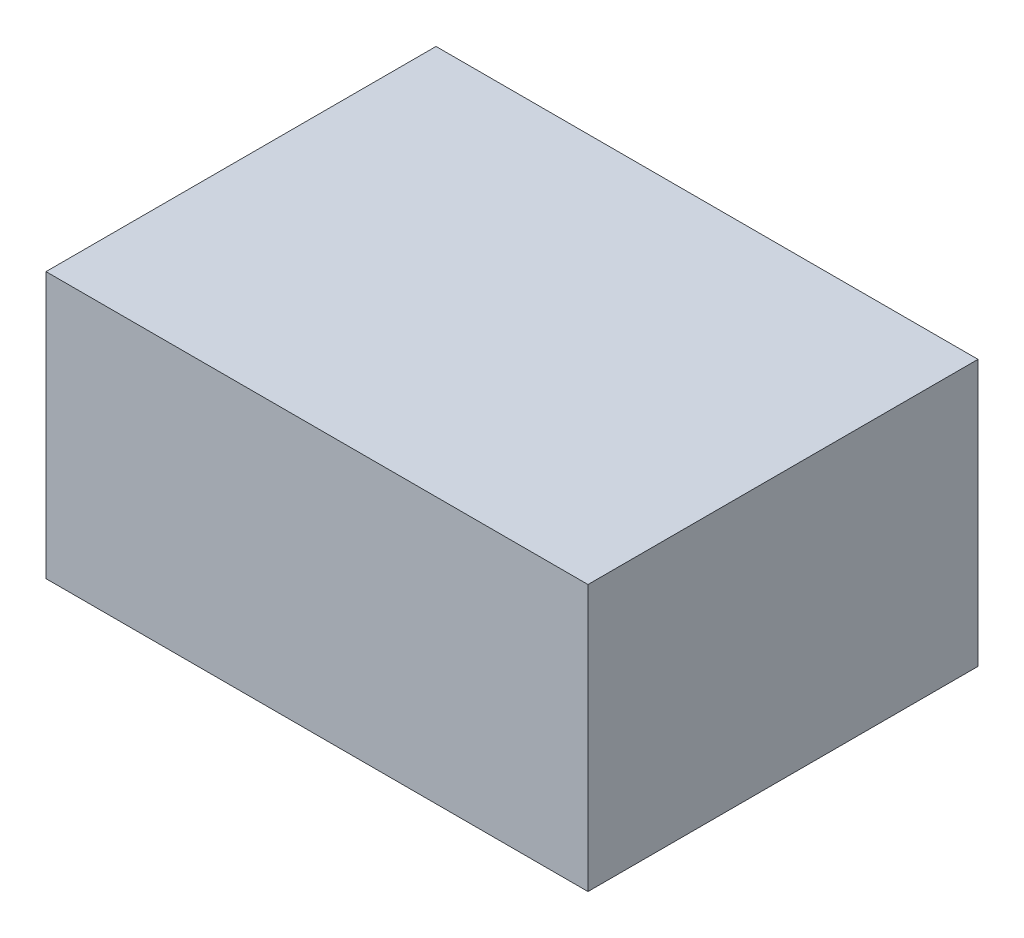
ISO-10303-21;
HEADER;
FILE_DESCRIPTION(('STEP AP214'),'2;1');
FILE_NAME('part.step','',(''),(''),'','','');
FILE_SCHEMA(('AUTOMOTIVE_DESIGN { 1 0 10303 214 1 1 1 1 }'));
ENDSEC;
DATA;
#1=APPLICATION_CONTEXT('core data for automotive mechanical design processes');
#2=APPLICATION_PROTOCOL_DEFINITION('international standard','automotive_design',2000,#1);
#3=PRODUCT_CONTEXT('',#1,'mechanical');
#4=PRODUCT('Part','Part','',(#3));
#5=PRODUCT_RELATED_PRODUCT_CATEGORY('part','',(#4));
#6=PRODUCT_DEFINITION_FORMATION('','',#4);
#7=PRODUCT_DEFINITION_CONTEXT('part definition',#1,'design');
#8=PRODUCT_DEFINITION('design','',#6,#7);
#9=PRODUCT_DEFINITION_SHAPE('','',#8);
#10=(LENGTH_UNIT() NAMED_UNIT(*) SI_UNIT(.MILLI.,.METRE.));
#11=(NAMED_UNIT(*) PLANE_ANGLE_UNIT() SI_UNIT($,.RADIAN.));
#12=(NAMED_UNIT(*) SI_UNIT($,.STERADIAN.) SOLID_ANGLE_UNIT());
#13=UNCERTAINTY_MEASURE_WITH_UNIT(LENGTH_MEASURE(1.E-05),#10,'distance_accuracy_value','');
#14=(GEOMETRIC_REPRESENTATION_CONTEXT(3) GLOBAL_UNCERTAINTY_ASSIGNED_CONTEXT((#13)) GLOBAL_UNIT_ASSIGNED_CONTEXT((#10,
#11,#12)) REPRESENTATION_CONTEXT('',''));
#15=CARTESIAN_POINT('',(0.,0.,0.));
#16=DIRECTION('',(0.,0.,1.));
#17=DIRECTION('',(1.,0.,0.));
#18=AXIS2_PLACEMENT_3D('',#15,#16,#17);
#19=CARTESIAN_POINT('',(42.8,42.,30.8));
#20=DIRECTION('',(-1.,0.,0.));
#21=DIRECTION('',(0.,0.,1.));
#22=AXIS2_PLACEMENT_3D('',#19,#20,#21);
#23=PLANE('',#22);
#24=DIRECTION('',(0.,0.,-1.));
#25=VECTOR('',#24,1.);
#26=CARTESIAN_POINT('',(42.8,0.,30.8));
#27=LINE('',#26,#25);
#28=CARTESIAN_POINT('',(42.8,0.,30.8));
#29=VERTEX_POINT('',#28);
#30=CARTESIAN_POINT('',(42.8,0.,-30.8));
#31=VERTEX_POINT('',#30);
#32=EDGE_CURVE('E113',#29,#31,#27,.T.);
#33=ORIENTED_EDGE('',*,*,#32,.T.);
#34=DIRECTION('',(0.,-1.,0.));
#35=VECTOR('',#34,1.);
#36=CARTESIAN_POINT('',(42.8,42.,-30.8));
#37=LINE('',#36,#35);
#38=CARTESIAN_POINT('',(42.8,42.,-30.8));
#39=VERTEX_POINT('',#38);
#40=EDGE_CURVE('E11',#39,#31,#37,.T.);
#41=ORIENTED_EDGE('',*,*,#40,.F.);
#42=DIRECTION('',(0.,0.,-1.));
#43=VECTOR('',#42,1.);
#44=CARTESIAN_POINT('',(42.8,42.,30.8));
#45=LINE('',#44,#43);
#46=CARTESIAN_POINT('',(42.8,42.,30.8));
#47=VERTEX_POINT('',#46);
#48=EDGE_CURVE('E97',#47,#39,#45,.T.);
#49=ORIENTED_EDGE('',*,*,#48,.F.);
#50=DIRECTION('',(0.,-1.,0.));
#51=VECTOR('',#50,1.);
#52=CARTESIAN_POINT('',(42.8,42.,30.8));
#53=LINE('',#52,#51);
#54=EDGE_CURVE('E109',#47,#29,#53,.T.);
#55=ORIENTED_EDGE('',*,*,#54,.T.);
#56=EDGE_LOOP('',(#33,#41,#49,#55));
#57=FACE_BOUND('',#56,.T.);
#58=ADVANCED_FACE('F45',(#57),#23,.F.);
#59=CARTESIAN_POINT('',(-42.8,42.,-30.8));
#60=DIRECTION('',(0.,0.,1.));
#61=DIRECTION('',(1.,0.,0.));
#62=AXIS2_PLACEMENT_3D('',#59,#60,#61);
#63=PLANE('',#62);
#64=DIRECTION('',(-1.,0.,0.));
#65=VECTOR('',#64,1.);
#66=CARTESIAN_POINT('',(-42.8,0.,-30.8));
#67=LINE('',#66,#65);
#68=CARTESIAN_POINT('',(-42.8,0.,-30.8));
#69=VERTEX_POINT('',#68);
#70=EDGE_CURVE('E102',#31,#69,#67,.T.);
#71=ORIENTED_EDGE('',*,*,#70,.T.);
#72=DIRECTION('',(0.,-1.,0.));
#73=VECTOR('',#72,1.);
#74=CARTESIAN_POINT('',(-42.8,42.,-30.8));
#75=LINE('',#74,#73);
#76=CARTESIAN_POINT('',(-42.8,42.,-30.8));
#77=VERTEX_POINT('',#76);
#78=EDGE_CURVE('E54',#77,#69,#75,.T.);
#79=ORIENTED_EDGE('',*,*,#78,.F.);
#80=DIRECTION('',(-1.,0.,0.));
#81=VECTOR('',#80,1.);
#82=CARTESIAN_POINT('',(-42.8,42.,-30.8));
#83=LINE('',#82,#81);
#84=EDGE_CURVE('E92',#39,#77,#83,.T.);
#85=ORIENTED_EDGE('',*,*,#84,.F.);
#86=ORIENTED_EDGE('',*,*,#40,.T.);
#87=EDGE_LOOP('',(#71,#79,#85,#86));
#88=FACE_BOUND('',#87,.T.);
#89=ADVANCED_FACE('F101',(#88),#63,.F.);
#90=CARTESIAN_POINT('',(-42.8,42.,30.8));
#91=DIRECTION('',(1.,0.,0.));
#92=DIRECTION('',(0.,0.,-1.));
#93=AXIS2_PLACEMENT_3D('',#90,#91,#92);
#94=PLANE('',#93);
#95=DIRECTION('',(0.,0.,1.));
#96=VECTOR('',#95,1.);
#97=CARTESIAN_POINT('',(-42.8,0.,30.8));
#98=LINE('',#97,#96);
#99=CARTESIAN_POINT('',(-42.8,0.,30.8));
#100=VERTEX_POINT('',#99);
#101=EDGE_CURVE('E79',#69,#100,#98,.T.);
#102=ORIENTED_EDGE('',*,*,#101,.T.);
#103=DIRECTION('',(0.,-1.,0.));
#104=VECTOR('',#103,1.);
#105=CARTESIAN_POINT('',(-42.8,42.,30.8));
#106=LINE('',#105,#104);
#107=CARTESIAN_POINT('',(-42.8,42.,30.8));
#108=VERTEX_POINT('',#107);
#109=EDGE_CURVE('E104',#108,#100,#106,.T.);
#110=ORIENTED_EDGE('',*,*,#109,.F.);
#111=DIRECTION('',(0.,0.,1.));
#112=VECTOR('',#111,1.);
#113=CARTESIAN_POINT('',(-42.8,42.,30.8));
#114=LINE('',#113,#112);
#115=EDGE_CURVE('E95',#77,#108,#114,.T.);
#116=ORIENTED_EDGE('',*,*,#115,.F.);
#117=ORIENTED_EDGE('',*,*,#78,.T.);
#118=EDGE_LOOP('',(#102,#110,#116,#117));
#119=FACE_BOUND('',#118,.T.);
#120=ADVANCED_FACE('F105',(#119),#94,.F.);
#121=CARTESIAN_POINT('',(-42.8,42.,30.8));
#122=DIRECTION('',(0.,0.,-1.));
#123=DIRECTION('',(-1.,0.,0.));
#124=AXIS2_PLACEMENT_3D('',#121,#122,#123);
#125=PLANE('',#124);
#126=DIRECTION('',(1.,0.,0.));
#127=VECTOR('',#126,1.);
#128=CARTESIAN_POINT('',(-42.8,0.,30.8));
#129=LINE('',#128,#127);
#130=EDGE_CURVE('E85',#100,#29,#129,.T.);
#131=ORIENTED_EDGE('',*,*,#130,.T.);
#132=ORIENTED_EDGE('',*,*,#54,.F.);
#133=DIRECTION('',(1.,0.,0.));
#134=VECTOR('',#133,1.);
#135=CARTESIAN_POINT('',(-42.8,42.,30.8));
#136=LINE('',#135,#134);
#137=EDGE_CURVE('E62',#108,#47,#136,.T.);
#138=ORIENTED_EDGE('',*,*,#137,.F.);
#139=ORIENTED_EDGE('',*,*,#109,.T.);
#140=EDGE_LOOP('',(#131,#132,#138,#139));
#141=FACE_BOUND('',#140,.T.);
#142=ADVANCED_FACE('F126',(#141),#125,.F.);
#143=CARTESIAN_POINT('',(0.,42.,0.));
#144=DIRECTION('',(0.,-1.,0.));
#145=DIRECTION('',(0.,0.,-1.));
#146=AXIS2_PLACEMENT_3D('',#143,#144,#145);
#147=PLANE('',#146);
#148=ORIENTED_EDGE('',*,*,#48,.T.);
#149=ORIENTED_EDGE('',*,*,#84,.T.);
#150=ORIENTED_EDGE('',*,*,#115,.T.);
#151=ORIENTED_EDGE('',*,*,#137,.T.);
#152=EDGE_LOOP('',(#148,#149,#150,#151));
#153=FACE_BOUND('',#152,.T.);
#154=ADVANCED_FACE('F93',(#153),#147,.F.);
#155=CARTESIAN_POINT('',(0.,0.,0.));
#156=DIRECTION('',(0.,-1.,0.));
#157=DIRECTION('',(0.,0.,-1.));
#158=AXIS2_PLACEMENT_3D('',#155,#156,#157);
#159=PLANE('',#158);
#160=ORIENTED_EDGE('',*,*,#32,.F.);
#161=ORIENTED_EDGE('',*,*,#130,.F.);
#162=ORIENTED_EDGE('',*,*,#101,.F.);
#163=ORIENTED_EDGE('',*,*,#70,.F.);
#164=EDGE_LOOP('',(#160,#161,#162,#163));
#165=FACE_BOUND('',#164,.T.);
#166=ADVANCED_FACE('F129',(#165),#159,.T.);
#167=CLOSED_SHELL('',(#58,#89,#120,#142,#154,#166));
#168=MANIFOLD_SOLID_BREP('B2',#167);
#169=ADVANCED_BREP_SHAPE_REPRESENTATION('',(#18,#168),#14);
#170=SHAPE_DEFINITION_REPRESENTATION(#9,#169);
ENDSEC;
END-ISO-10303-21;
